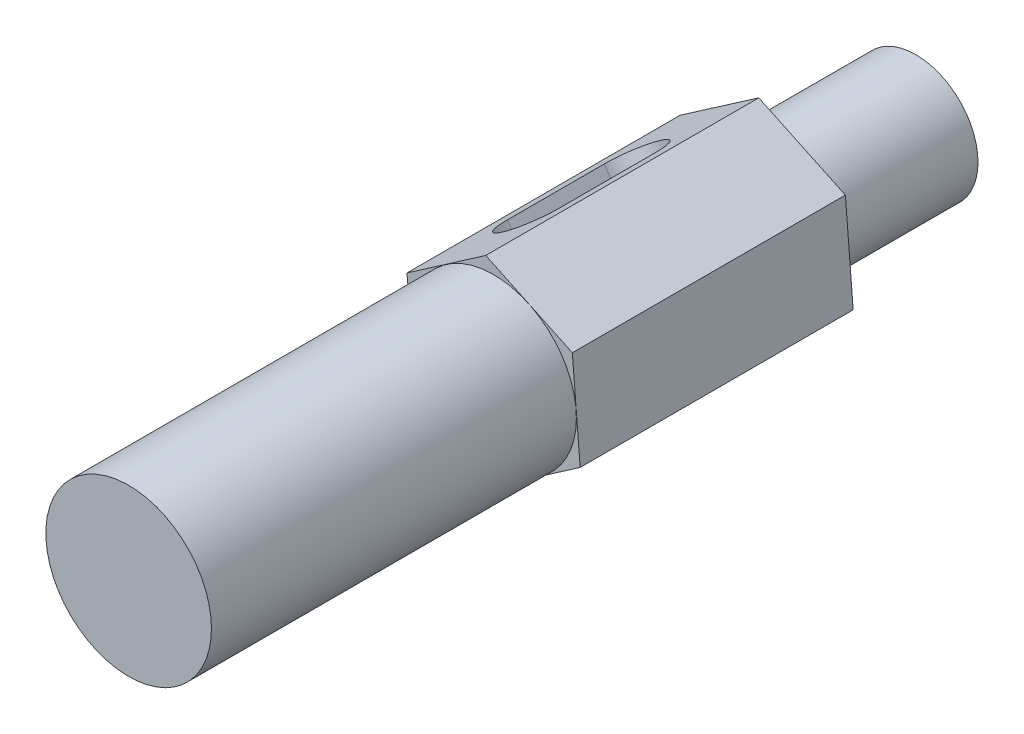
ISO-10303-21;
HEADER;
FILE_DESCRIPTION(('STEP AP214'),'2;1');
FILE_NAME('part.step','',(''),(''),'','','');
FILE_SCHEMA(('AUTOMOTIVE_DESIGN { 1 0 10303 214 1 1 1 1 }'));
ENDSEC;
DATA;
#1=APPLICATION_CONTEXT('core data for automotive mechanical design processes');
#2=APPLICATION_PROTOCOL_DEFINITION('international standard','automotive_design',2000,#1);
#3=PRODUCT_CONTEXT('',#1,'mechanical');
#4=PRODUCT('Part','Part','',(#3));
#5=PRODUCT_RELATED_PRODUCT_CATEGORY('part','',(#4));
#6=PRODUCT_DEFINITION_FORMATION('','',#4);
#7=PRODUCT_DEFINITION_CONTEXT('part definition',#1,'design');
#8=PRODUCT_DEFINITION('design','',#6,#7);
#9=PRODUCT_DEFINITION_SHAPE('','',#8);
#10=(LENGTH_UNIT() NAMED_UNIT(*) SI_UNIT(.MILLI.,.METRE.));
#11=(NAMED_UNIT(*) PLANE_ANGLE_UNIT() SI_UNIT($,.RADIAN.));
#12=(NAMED_UNIT(*) SI_UNIT($,.STERADIAN.) SOLID_ANGLE_UNIT());
#13=UNCERTAINTY_MEASURE_WITH_UNIT(LENGTH_MEASURE(1.E-05),#10,'distance_accuracy_value','');
#14=(GEOMETRIC_REPRESENTATION_CONTEXT(3) GLOBAL_UNCERTAINTY_ASSIGNED_CONTEXT((#13)) GLOBAL_UNIT_ASSIGNED_CONTEXT((#10,
#11,#12)) REPRESENTATION_CONTEXT('',''));
#15=CARTESIAN_POINT('',(0.,0.,0.));
#16=DIRECTION('',(0.,0.,1.));
#17=DIRECTION('',(1.,0.,0.));
#18=AXIS2_PLACEMENT_3D('',#15,#16,#17);
#19=CARTESIAN_POINT('',(0.,0.,0.));
#20=DIRECTION('',(0.,0.,1.));
#21=DIRECTION('',(1.,0.,0.));
#22=AXIS2_PLACEMENT_3D('',#19,#20,#21);
#23=PLANE('',#22);
#24=DIRECTION('',(-0.0816228026846181,0.996663292231588,0.));
#25=VECTOR('',#24,1.);
#26=CARTESIAN_POINT('',(6.62805531976813,-3.13563646034209,0.));
#27=LINE('',#26,#25);
#28=CARTESIAN_POINT('',(6.62805531976813,-3.13563646034209,0.));
#29=VERTEX_POINT('',#28);
#30=CARTESIAN_POINT('',(6.02956849157304,4.17224605443674,0.));
#31=VERTEX_POINT('',#30);
#32=EDGE_CURVE('E195',#29,#31,#27,.T.);
#33=ORIENTED_EDGE('',*,*,#32,.F.);
#34=DIRECTION('',(0.82232432874968,0.569019066768758,0.));
#35=VECTOR('',#34,1.);
#36=CARTESIAN_POINT('',(0.598486828195092,-7.30788251477884,0.));
#37=LINE('',#36,#35);
#38=CARTESIAN_POINT('',(0.598486828195092,-7.30788251477884,0.));
#39=VERTEX_POINT('',#38);
#40=EDGE_CURVE('E200',#39,#29,#37,.T.);
#41=ORIENTED_EDGE('',*,*,#40,.F.);
#42=DIRECTION('',(0.903947131434298,-0.42764422546283,0.));
#43=VECTOR('',#42,1.);
#44=CARTESIAN_POINT('',(-6.02956849157303,-4.17224605443674,0.));
#45=LINE('',#44,#43);
#46=CARTESIAN_POINT('',(-6.02956849157303,-4.17224605443674,0.));
#47=VERTEX_POINT('',#46);
#48=EDGE_CURVE('E219',#47,#39,#45,.T.);
#49=ORIENTED_EDGE('',*,*,#48,.F.);
#50=DIRECTION('',(0.0816228026846182,-0.996663292231588,0.));
#51=VECTOR('',#50,1.);
#52=CARTESIAN_POINT('',(-6.62805531976813,3.13563646034209,0.));
#53=LINE('',#52,#51);
#54=CARTESIAN_POINT('',(-6.62805531976813,3.13563646034209,0.));
#55=VERTEX_POINT('',#54);
#56=EDGE_CURVE('E217',#55,#47,#53,.T.);
#57=ORIENTED_EDGE('',*,*,#56,.F.);
#58=DIRECTION('',(-0.82232432874968,-0.569019066768758,0.));
#59=VECTOR('',#58,1.);
#60=CARTESIAN_POINT('',(-0.598486828195094,7.30788251477884,0.));
#61=LINE('',#60,#59);
#62=CARTESIAN_POINT('',(-0.598486828195094,7.30788251477884,0.));
#63=VERTEX_POINT('',#62);
#64=EDGE_CURVE('E215',#63,#55,#61,.T.);
#65=ORIENTED_EDGE('',*,*,#64,.F.);
#66=DIRECTION('',(-0.903947131434298,0.42764422546283,0.));
#67=VECTOR('',#66,1.);
#68=CARTESIAN_POINT('',(6.02956849157304,4.17224605443674,0.));
#69=LINE('',#68,#67);
#70=EDGE_CURVE('E213',#31,#63,#69,.T.);
#71=ORIENTED_EDGE('',*,*,#70,.F.);
#72=EDGE_LOOP('',(#33,#41,#49,#57,#65,#71));
#73=FACE_BOUND('',#72,.T.);
#74=CARTESIAN_POINT('',(0.,0.,0.));
#75=DIRECTION('',(0.,0.,1.));
#76=DIRECTION('',(1.,0.,0.));
#77=AXIS2_PLACEMENT_3D('',#74,#75,#76);
#78=CIRCLE('',#77,4.75361);
#79=CARTESIAN_POINT('',(4.75361,0.,0.));
#80=VERTEX_POINT('',#79);
#81=EDGE_CURVE('E239',#80,#80,#78,.F.);
#82=ORIENTED_EDGE('',*,*,#81,.F.);
#83=EDGE_LOOP('',(#82));
#84=FACE_BOUND('',#83,.T.);
#85=ADVANCED_FACE('F33',(#73,#84),#23,.F.);
#86=CARTESIAN_POINT('',(0.,0.,20.9042));
#87=DIRECTION('',(0.,0.,1.));
#88=DIRECTION('',(1.,0.,0.));
#89=AXIS2_PLACEMENT_3D('',#86,#87,#88);
#90=PLANE('',#89);
#91=CARTESIAN_POINT('',(0.,0.,20.9042));
#92=DIRECTION('',(0.,0.,1.));
#93=DIRECTION('',(1.,0.,0.));
#94=AXIS2_PLACEMENT_3D('',#91,#92,#93);
#95=CIRCLE('',#94,6.33984);
#96=CARTESIAN_POINT('',(6.33984,0.,20.9042));
#97=VERTEX_POINT('',#96);
#98=EDGE_CURVE('E186',#97,#97,#95,.T.);
#99=ORIENTED_EDGE('',*,*,#98,.F.);
#100=EDGE_LOOP('',(#99));
#101=FACE_BOUND('',#100,.T.);
#102=DIRECTION('',(-0.0816228026846181,0.996663292231588,0.));
#103=VECTOR('',#102,1.);
#104=CARTESIAN_POINT('',(6.62805531976813,-3.13563646034209,20.9042));
#105=LINE('',#104,#103);
#106=CARTESIAN_POINT('',(6.62805531976813,-3.13563646034209,20.9042));
#107=VERTEX_POINT('',#106);
#108=CARTESIAN_POINT('',(6.02956849157304,4.17224605443674,20.9042));
#109=VERTEX_POINT('',#108);
#110=EDGE_CURVE('E196',#107,#109,#105,.T.);
#111=ORIENTED_EDGE('',*,*,#110,.T.);
#112=DIRECTION('',(-0.903947131434298,0.42764422546283,0.));
#113=VECTOR('',#112,1.);
#114=CARTESIAN_POINT('',(6.02956849157304,4.17224605443674,20.9042));
#115=LINE('',#114,#113);
#116=CARTESIAN_POINT('',(-0.598486828195094,7.30788251477884,20.9042));
#117=VERTEX_POINT('',#116);
#118=EDGE_CURVE('E199',#109,#117,#115,.T.);
#119=ORIENTED_EDGE('',*,*,#118,.T.);
#120=DIRECTION('',(-0.82232432874968,-0.569019066768758,0.));
#121=VECTOR('',#120,1.);
#122=CARTESIAN_POINT('',(-0.598486828195094,7.30788251477884,20.9042));
#123=LINE('',#122,#121);
#124=CARTESIAN_POINT('',(-6.62805531976813,3.13563646034209,20.9042));
#125=VERTEX_POINT('',#124);
#126=EDGE_CURVE('E202',#117,#125,#123,.T.);
#127=ORIENTED_EDGE('',*,*,#126,.T.);
#128=DIRECTION('',(0.0816228026846182,-0.996663292231588,0.));
#129=VECTOR('',#128,1.);
#130=CARTESIAN_POINT('',(-6.62805531976813,3.13563646034209,20.9042));
#131=LINE('',#130,#129);
#132=CARTESIAN_POINT('',(-6.02956849157303,-4.17224605443674,20.9042));
#133=VERTEX_POINT('',#132);
#134=EDGE_CURVE('E204',#125,#133,#131,.T.);
#135=ORIENTED_EDGE('',*,*,#134,.T.);
#136=DIRECTION('',(0.903947131434298,-0.42764422546283,0.));
#137=VECTOR('',#136,1.);
#138=CARTESIAN_POINT('',(-6.02956849157303,-4.17224605443674,20.9042));
#139=LINE('',#138,#137);
#140=CARTESIAN_POINT('',(0.598486828195092,-7.30788251477884,20.9042));
#141=VERTEX_POINT('',#140);
#142=EDGE_CURVE('E206',#133,#141,#139,.T.);
#143=ORIENTED_EDGE('',*,*,#142,.T.);
#144=DIRECTION('',(0.82232432874968,0.569019066768758,0.));
#145=VECTOR('',#144,1.);
#146=CARTESIAN_POINT('',(0.598486828195092,-7.30788251477884,20.9042));
#147=LINE('',#146,#145);
#148=EDGE_CURVE('E208',#141,#107,#147,.T.);
#149=ORIENTED_EDGE('',*,*,#148,.T.);
#150=EDGE_LOOP('',(#111,#119,#127,#135,#143,#149));
#151=FACE_BOUND('',#150,.T.);
#152=ADVANCED_FACE('F324',(#101,#151),#90,.T.);
#153=CARTESIAN_POINT('',(6.62805531976813,-3.13563646034209,20.9042));
#154=DIRECTION('',(-0.996663292231588,-0.0816228026846181,0.));
#155=DIRECTION('',(0.0816228026846181,-0.996663292231588,0.));
#156=AXIS2_PLACEMENT_3D('',#153,#154,#155);
#157=PLANE('',#156);
#158=ORIENTED_EDGE('',*,*,#32,.T.);
#159=DIRECTION('',(0.,0.,-1.));
#160=VECTOR('',#159,1.);
#161=CARTESIAN_POINT('',(6.02956849157304,4.17224605443674,20.9042));
#162=LINE('',#161,#160);
#163=EDGE_CURVE('E236',#109,#31,#162,.T.);
#164=ORIENTED_EDGE('',*,*,#163,.F.);
#165=ORIENTED_EDGE('',*,*,#110,.F.);
#166=DIRECTION('',(0.,0.,-1.));
#167=VECTOR('',#166,1.);
#168=CARTESIAN_POINT('',(6.62805531976813,-3.13563646034209,20.9042));
#169=LINE('',#168,#167);
#170=EDGE_CURVE('E210',#107,#29,#169,.T.);
#171=ORIENTED_EDGE('',*,*,#170,.T.);
#172=EDGE_LOOP('',(#158,#164,#165,#171));
#173=FACE_BOUND('',#172,.T.);
#174=ADVANCED_FACE('F35',(#173),#157,.F.);
#175=CARTESIAN_POINT('',(6.02956849157304,4.17224605443674,20.9042));
#176=DIRECTION('',(-0.42764422546283,-0.903947131434298,0.));
#177=DIRECTION('',(0.903947131434298,-0.42764422546283,0.));
#178=AXIS2_PLACEMENT_3D('',#175,#176,#177);
#179=PLANE('',#178);
#180=ORIENTED_EDGE('',*,*,#70,.T.);
#181=DIRECTION('',(0.,0.,-1.));
#182=VECTOR('',#181,1.);
#183=CARTESIAN_POINT('',(-0.598486828195094,7.30788251477884,20.9042));
#184=LINE('',#183,#182);
#185=EDGE_CURVE('E233',#117,#63,#184,.T.);
#186=ORIENTED_EDGE('',*,*,#185,.F.);
#187=ORIENTED_EDGE('',*,*,#118,.F.);
#188=ORIENTED_EDGE('',*,*,#163,.T.);
#189=EDGE_LOOP('',(#180,#186,#187,#188));
#190=FACE_BOUND('',#189,.T.);
#191=ADVANCED_FACE('F342',(#190),#179,.F.);
#192=CARTESIAN_POINT('',(-0.598486828195094,7.30788251477884,20.9042));
#193=DIRECTION('',(0.569019066768758,-0.82232432874968,0.));
#194=DIRECTION('',(0.82232432874968,0.569019066768758,0.));
#195=AXIS2_PLACEMENT_3D('',#192,#193,#194);
#196=PLANE('',#195);
#197=DIRECTION('',(0.,0.,-1.));
#198=VECTOR('',#197,1.);
#199=CARTESIAN_POINT('',(-1.64988950665888,6.58034941137755,14.2748));
#200=LINE('',#199,#198);
#201=CARTESIAN_POINT('',(-1.64988950665888,6.58034941137755,14.2748));
#202=VERTEX_POINT('',#201);
#203=CARTESIAN_POINT('',(-1.64988950665888,6.58034941137755,6.858));
#204=VERTEX_POINT('',#203);
#205=EDGE_CURVE('E154',#202,#204,#200,.T.);
#206=ORIENTED_EDGE('',*,*,#205,.F.);
#207=CARTESIAN_POINT('',(-3.61327107398161,5.22175948756047,14.2748));
#208=DIRECTION('',(-0.569019066768758,0.82232432874968,0.));
#209=DIRECTION('',(-0.82232432874968,-0.569019066768758,0.));
#210=AXIS2_PLACEMENT_3D('',#207,#208,#209);
#211=CIRCLE('',#210,2.3876);
#212=CARTESIAN_POINT('',(-5.57665264130435,3.86316956374338,14.2748));
#213=VERTEX_POINT('',#212);
#214=EDGE_CURVE('E53',#213,#202,#211,.T.);
#215=ORIENTED_EDGE('',*,*,#214,.F.);
#216=DIRECTION('',(0.,0.,1.));
#217=VECTOR('',#216,1.);
#218=CARTESIAN_POINT('',(-5.57665264130435,3.86316956374338,14.2748));
#219=LINE('',#218,#217);
#220=CARTESIAN_POINT('',(-5.57665264130435,3.86316956374338,6.858));
#221=VERTEX_POINT('',#220);
#222=EDGE_CURVE('E162',#221,#213,#219,.T.);
#223=ORIENTED_EDGE('',*,*,#222,.F.);
#224=CARTESIAN_POINT('',(-3.61327107398161,5.22175948756047,6.858));
#225=DIRECTION('',(-0.569019066768758,0.82232432874968,0.));
#226=DIRECTION('',(-0.82232432874968,-0.569019066768758,0.));
#227=AXIS2_PLACEMENT_3D('',#224,#225,#226);
#228=CIRCLE('',#227,2.3876);
#229=EDGE_CURVE('E145',#204,#221,#228,.T.);
#230=ORIENTED_EDGE('',*,*,#229,.F.);
#231=EDGE_LOOP('',(#206,#215,#223,#230));
#232=FACE_BOUND('',#231,.T.);
#233=ORIENTED_EDGE('',*,*,#64,.T.);
#234=DIRECTION('',(0.,0.,-1.));
#235=VECTOR('',#234,1.);
#236=CARTESIAN_POINT('',(-6.62805531976813,3.13563646034209,20.9042));
#237=LINE('',#236,#235);
#238=EDGE_CURVE('E230',#125,#55,#237,.T.);
#239=ORIENTED_EDGE('',*,*,#238,.F.);
#240=ORIENTED_EDGE('',*,*,#126,.F.);
#241=ORIENTED_EDGE('',*,*,#185,.T.);
#242=EDGE_LOOP('',(#233,#239,#240,#241));
#243=FACE_BOUND('',#242,.T.);
#244=ADVANCED_FACE('F159',(#232,#243),#196,.F.);
#245=CARTESIAN_POINT('',(-6.62805531976813,3.13563646034209,20.9042));
#246=DIRECTION('',(0.996663292231588,0.0816228026846182,0.));
#247=DIRECTION('',(-0.0816228026846182,0.996663292231588,0.));
#248=AXIS2_PLACEMENT_3D('',#245,#246,#247);
#249=PLANE('',#248);
#250=ORIENTED_EDGE('',*,*,#56,.T.);
#251=DIRECTION('',(0.,0.,-1.));
#252=VECTOR('',#251,1.);
#253=CARTESIAN_POINT('',(-6.02956849157303,-4.17224605443674,20.9042));
#254=LINE('',#253,#252);
#255=EDGE_CURVE('E227',#133,#47,#254,.T.);
#256=ORIENTED_EDGE('',*,*,#255,.F.);
#257=ORIENTED_EDGE('',*,*,#134,.F.);
#258=ORIENTED_EDGE('',*,*,#238,.T.);
#259=EDGE_LOOP('',(#250,#256,#257,#258));
#260=FACE_BOUND('',#259,.T.);
#261=ADVANCED_FACE('F336',(#260),#249,.F.);
#262=CARTESIAN_POINT('',(-6.02956849157303,-4.17224605443674,20.9042));
#263=DIRECTION('',(0.42764422546283,0.903947131434298,0.));
#264=DIRECTION('',(-0.903947131434298,0.42764422546283,0.));
#265=AXIS2_PLACEMENT_3D('',#262,#263,#264);
#266=PLANE('',#265);
#267=ORIENTED_EDGE('',*,*,#48,.T.);
#268=DIRECTION('',(0.,0.,-1.));
#269=VECTOR('',#268,1.);
#270=CARTESIAN_POINT('',(0.598486828195092,-7.30788251477884,20.9042));
#271=LINE('',#270,#269);
#272=EDGE_CURVE('E224',#141,#39,#271,.T.);
#273=ORIENTED_EDGE('',*,*,#272,.F.);
#274=ORIENTED_EDGE('',*,*,#142,.F.);
#275=ORIENTED_EDGE('',*,*,#255,.T.);
#276=EDGE_LOOP('',(#267,#273,#274,#275));
#277=FACE_BOUND('',#276,.T.);
#278=ADVANCED_FACE('F318',(#277),#266,.F.);
#279=CARTESIAN_POINT('',(0.598486828195092,-7.30788251477884,20.9042));
#280=DIRECTION('',(-0.569019066768758,0.82232432874968,0.));
#281=DIRECTION('',(-0.82232432874968,-0.569019066768758,0.));
#282=AXIS2_PLACEMENT_3D('',#279,#280,#281);
#283=PLANE('',#282);
#284=DIRECTION('',(0.,0.,-1.));
#285=VECTOR('',#284,1.);
#286=CARTESIAN_POINT('',(1.64988950665888,-6.58034941137755,14.2748));
#287=LINE('',#286,#285);
#288=CARTESIAN_POINT('',(1.64988950665888,-6.58034941137755,14.2748));
#289=VERTEX_POINT('',#288);
#290=CARTESIAN_POINT('',(1.64988950665888,-6.58034941137755,6.858));
#291=VERTEX_POINT('',#290);
#292=EDGE_CURVE('E498',#289,#291,#287,.T.);
#293=ORIENTED_EDGE('',*,*,#292,.F.);
#294=CARTESIAN_POINT('',(3.61327107398161,-5.22175948756047,14.2748));
#295=DIRECTION('',(-0.569019066768758,0.82232432874968,0.));
#296=DIRECTION('',(-0.82232432874968,-0.569019066768758,0.));
#297=AXIS2_PLACEMENT_3D('',#294,#295,#296);
#298=CIRCLE('',#297,2.3876);
#299=CARTESIAN_POINT('',(5.57665264130435,-3.86316956374338,14.2748));
#300=VERTEX_POINT('',#299);
#301=EDGE_CURVE('E180',#300,#289,#298,.F.);
#302=ORIENTED_EDGE('',*,*,#301,.F.);
#303=DIRECTION('',(0.,0.,1.));
#304=VECTOR('',#303,1.);
#305=CARTESIAN_POINT('',(5.57665264130435,-3.86316956374338,14.2748));
#306=LINE('',#305,#304);
#307=CARTESIAN_POINT('',(5.57665264130435,-3.86316956374338,6.858));
#308=VERTEX_POINT('',#307);
#309=EDGE_CURVE('E177',#308,#300,#306,.T.);
#310=ORIENTED_EDGE('',*,*,#309,.F.);
#311=CARTESIAN_POINT('',(3.61327107398161,-5.22175948756047,6.858));
#312=DIRECTION('',(-0.569019066768758,0.82232432874968,0.));
#313=DIRECTION('',(-0.82232432874968,-0.569019066768758,0.));
#314=AXIS2_PLACEMENT_3D('',#311,#312,#313);
#315=CIRCLE('',#314,2.3876);
#316=EDGE_CURVE('E170',#291,#308,#315,.F.);
#317=ORIENTED_EDGE('',*,*,#316,.F.);
#318=EDGE_LOOP('',(#293,#302,#310,#317));
#319=FACE_BOUND('',#318,.T.);
#320=ORIENTED_EDGE('',*,*,#40,.T.);
#321=ORIENTED_EDGE('',*,*,#170,.F.);
#322=ORIENTED_EDGE('',*,*,#148,.F.);
#323=ORIENTED_EDGE('',*,*,#272,.T.);
#324=EDGE_LOOP('',(#320,#321,#322,#323));
#325=FACE_BOUND('',#324,.T.);
#326=ADVANCED_FACE('F313',(#319,#325),#283,.F.);
#327=CARTESIAN_POINT('',(0.,0.,48.8442));
#328=DIRECTION('',(0.,0.,-1.));
#329=DIRECTION('',(-1.,0.,0.));
#330=AXIS2_PLACEMENT_3D('',#327,#328,#329);
#331=CYLINDRICAL_SURFACE('',#330,6.33984);
#332=CARTESIAN_POINT('',(0.,0.,48.8442));
#333=DIRECTION('',(0.,0.,1.));
#334=DIRECTION('',(1.,0.,0.));
#335=AXIS2_PLACEMENT_3D('',#332,#333,#334);
#336=CIRCLE('',#335,6.33984);
#337=CARTESIAN_POINT('',(6.33984,0.,48.8442));
#338=VERTEX_POINT('',#337);
#339=EDGE_CURVE('E187',#338,#338,#336,.T.);
#340=ORIENTED_EDGE('',*,*,#339,.F.);
#341=EDGE_LOOP('',(#340));
#342=FACE_BOUND('',#341,.T.);
#343=ORIENTED_EDGE('',*,*,#98,.T.);
#344=EDGE_LOOP('',(#343));
#345=FACE_BOUND('',#344,.T.);
#346=ADVANCED_FACE('F308',(#342,#345),#331,.T.);
#347=CARTESIAN_POINT('',(0.,0.,48.8442));
#348=DIRECTION('',(0.,0.,1.));
#349=DIRECTION('',(1.,0.,0.));
#350=AXIS2_PLACEMENT_3D('',#347,#348,#349);
#351=PLANE('',#350);
#352=ORIENTED_EDGE('',*,*,#339,.T.);
#353=EDGE_LOOP('',(#352));
#354=FACE_BOUND('',#353,.T.);
#355=ADVANCED_FACE('F300',(#354),#351,.T.);
#356=CARTESIAN_POINT('',(0.,0.,-11.43));
#357=DIRECTION('',(0.,0.,-1.));
#358=DIRECTION('',(-1.,0.,0.));
#359=AXIS2_PLACEMENT_3D('',#356,#357,#358);
#360=PLANE('',#359);
#361=CARTESIAN_POINT('',(0.,0.,-11.43));
#362=DIRECTION('',(0.,0.,-1.));
#363=DIRECTION('',(-1.,0.,0.));
#364=AXIS2_PLACEMENT_3D('',#361,#362,#363);
#365=CIRCLE('',#364,4.75361);
#366=CARTESIAN_POINT('',(-4.75361,0.,-11.43));
#367=VERTEX_POINT('',#366);
#368=EDGE_CURVE('E183',#367,#367,#365,.T.);
#369=ORIENTED_EDGE('',*,*,#368,.T.);
#370=EDGE_LOOP('',(#369));
#371=FACE_BOUND('',#370,.T.);
#372=CARTESIAN_POINT('',(0.,0.,-11.43));
#373=DIRECTION('',(0.,0.,-1.));
#374=DIRECTION('',(-1.,0.,0.));
#375=AXIS2_PLACEMENT_3D('',#372,#373,#374);
#376=CIRCLE('',#375,2.7305);
#377=CARTESIAN_POINT('',(-2.7305,0.,-11.43));
#378=VERTEX_POINT('',#377);
#379=EDGE_CURVE('E179',#378,#378,#376,.T.);
#380=ORIENTED_EDGE('',*,*,#379,.F.);
#381=EDGE_LOOP('',(#380));
#382=FACE_BOUND('',#381,.T.);
#383=ADVANCED_FACE('F295',(#371,#382),#360,.T.);
#384=CARTESIAN_POINT('',(0.,0.,-11.43));
#385=DIRECTION('',(0.,0.,1.));
#386=DIRECTION('',(1.,0.,0.));
#387=AXIS2_PLACEMENT_3D('',#384,#385,#386);
#388=CYLINDRICAL_SURFACE('',#387,4.75361);
#389=ORIENTED_EDGE('',*,*,#368,.F.);
#390=EDGE_LOOP('',(#389));
#391=FACE_BOUND('',#390,.T.);
#392=ORIENTED_EDGE('',*,*,#81,.T.);
#393=EDGE_LOOP('',(#392));
#394=FACE_BOUND('',#393,.T.);
#395=ADVANCED_FACE('F299',(#391,#394),#388,.T.);
#396=CARTESIAN_POINT('',(0.,0.,20.9042));
#397=DIRECTION('',(0.,0.,1.));
#398=DIRECTION('',(1.,0.,0.));
#399=AXIS2_PLACEMENT_3D('',#396,#397,#398);
#400=PLANE('',#399);
#401=CARTESIAN_POINT('',(0.,0.,20.9042));
#402=DIRECTION('',(0.,0.,1.));
#403=DIRECTION('',(1.,0.,0.));
#404=AXIS2_PLACEMENT_3D('',#401,#402,#403);
#405=CIRCLE('',#404,2.7305);
#406=CARTESIAN_POINT('',(2.7305,0.,20.9042));
#407=VERTEX_POINT('',#406);
#408=EDGE_CURVE('E190',#407,#407,#405,.T.);
#409=ORIENTED_EDGE('',*,*,#408,.F.);
#410=EDGE_LOOP('',(#409));
#411=FACE_BOUND('',#410,.T.);
#412=ADVANCED_FACE('F304',(#411),#400,.F.);
#413=CARTESIAN_POINT('',(0.,0.,20.9042));
#414=DIRECTION('',(0.,0.,-1.));
#415=DIRECTION('',(-1.,0.,0.));
#416=AXIS2_PLACEMENT_3D('',#413,#414,#415);
#417=CYLINDRICAL_SURFACE('',#416,2.7305);
#418=CARTESIAN_POINT('',(-1.20956627222676,-2.44797460834288,14.2748));
#419=CARTESIAN_POINT('',(-1.20958804728556,-2.44795600574634,14.3137370238867));
#420=CARTESIAN_POINT('',(-1.20780500639254,-2.4488453625985,14.3526434063581));
#421=CARTESIAN_POINT('',(-1.20082907939943,-2.45227724346911,14.4299877879825));
#422=CARTESIAN_POINT('',(-1.19564412570554,-2.45481592154996,14.4684266653826));
#423=CARTESIAN_POINT('',(-1.17550456149749,-2.46455700969224,14.5813992865273));
#424=CARTESIAN_POINT('',(-1.15595075921854,-2.47389567432168,14.6549426633927));
#425=CARTESIAN_POINT('',(-1.0959945944534,-2.50118054513015,14.830381491283));
#426=CARTESIAN_POINT('',(-1.05015994536887,-2.521109613033,14.9300224901687));
#427=CARTESIAN_POINT('',(-0.944097354123204,-2.56273336483108,15.1218744964873));
#428=CARTESIAN_POINT('',(-0.883729638318483,-2.58444375499189,15.2140009431911));
#429=CARTESIAN_POINT('',(-0.766202411779167,-2.62136433599547,15.3725927853069));
#430=CARTESIAN_POINT('',(-0.710975907218241,-2.63698860750061,15.4404165165341));
#431=CARTESIAN_POINT('',(-0.595010324896942,-2.66555049927489,15.5718443555924));
#432=CARTESIAN_POINT('',(-0.534268318041817,-2.67848667985734,15.6354461899156));
#433=CARTESIAN_POINT('',(-0.408219379066574,-2.700568809728,15.7582798703896));
#434=CARTESIAN_POINT('',(-0.342926351007126,-2.70972575889771,15.8175239805732));
#435=CARTESIAN_POINT('',(-0.208183404593132,-2.72339480295892,15.9316622893514));
#436=CARTESIAN_POINT('',(-0.138733147709464,-2.72790651903646,15.9865561328493));
#437=CARTESIAN_POINT('',(0.0422689357816321,-2.73237618038784,16.1199533663154));
#438=CARTESIAN_POINT('',(0.156352189690837,-2.72857333586334,16.1952512508472));
#439=CARTESIAN_POINT('',(0.390846258105553,-2.70494255615682,16.3322163094893));
#440=CARTESIAN_POINT('',(0.511247918203365,-2.68513723775181,16.3939025647814));
#441=CARTESIAN_POINT('',(0.732262561931,-2.63245170536222,16.4904569928151));
#442=CARTESIAN_POINT('',(0.832363270033199,-2.60271104204245,16.5281834007108));
#443=CARTESIAN_POINT('',(1.03196256092881,-2.53020335705912,16.5905494006242));
#444=CARTESIAN_POINT('',(1.13146148948677,-2.48744472321266,16.61519739144));
#445=CARTESIAN_POINT('',(1.32715890684583,-2.38879429421875,16.6498763383856));
#446=CARTESIAN_POINT('',(1.42333740447988,-2.33283495800721,16.6598301448504));
#447=CARTESIAN_POINT('',(1.60833539080505,-2.20935405894872,16.6640917202423));
#448=CARTESIAN_POINT('',(1.69715623227065,-2.14183462856658,16.6584023719176));
#449=CARTESIAN_POINT('',(1.85745164654654,-2.0039303436805,16.6329799056286));
#450=CARTESIAN_POINT('',(1.92975849987152,-1.93427420763016,16.6144788166646));
#451=CARTESIAN_POINT('',(2.06452403769368,-1.78973277590448,16.5658872006935));
#452=CARTESIAN_POINT('',(2.1269808919004,-1.71484651210736,16.5357945233482));
#453=CARTESIAN_POINT('',(2.24550632836589,-1.55683801181048,16.4630741143019));
#454=CARTESIAN_POINT('',(2.30084527588764,-1.47350285777679,16.4197295110521));
#455=CARTESIAN_POINT('',(2.40005108995942,-1.30572264364609,16.32329775837));
#456=CARTESIAN_POINT('',(2.44391126700306,-1.22127696633725,16.2702049584896));
#457=CARTESIAN_POINT('',(2.54085450459287,-1.00961574642037,16.1262181412084));
#458=CARTESIAN_POINT('',(2.58701315175088,-0.882821754159293,16.0299575119011));
#459=CARTESIAN_POINT('',(2.64058232284328,-0.697936649433188,15.8741066695275));
#460=CARTESIAN_POINT('',(2.65584108672536,-0.637083262872441,15.8201341312328));
#461=CARTESIAN_POINT('',(2.68164866417678,-0.517786498965325,15.7085052265537));
#462=CARTESIAN_POINT('',(2.69219873031374,-0.459342484457465,15.6508498445183));
#463=CARTESIAN_POINT('',(2.70793232523005,-0.353782377323793,15.5404065546315));
#464=CARTESIAN_POINT('',(2.71366725558983,-0.306240884134682,15.4881002341141));
#465=CARTESIAN_POINT('',(2.72248322429048,-0.214132986918551,15.3807213153246));
#466=CARTESIAN_POINT('',(2.72556475522915,-0.169566032092793,15.3256492325202));
#467=CARTESIAN_POINT('',(2.72952957875357,-0.0843371453574596,15.2126553055604));
#468=CARTESIAN_POINT('',(2.7304176244207,-0.0436669538012805,15.1547399010614));
#469=CARTESIAN_POINT('',(2.73057124817036,0.0326420267651488,15.0357187484235));
#470=CARTESIAN_POINT('',(2.72983824041979,0.0682851723877777,14.9746158264045));
#471=CARTESIAN_POINT('',(2.72731640115077,0.136647231876165,14.8415903162704));
#472=CARTESIAN_POINT('',(2.72541457538757,0.168542484484725,14.7692363072673));
#473=CARTESIAN_POINT('',(2.72170654881676,0.220549096429303,14.6205708276218));
#474=CARTESIAN_POINT('',(2.7198999243009,0.240717551580314,14.5442805348074));
#475=CARTESIAN_POINT('',(2.71822960453197,0.258615972714549,14.4351360734195));
#476=CARTESIAN_POINT('',(2.71784868300098,0.262562443418339,14.4032640414765));
#477=CARTESIAN_POINT('',(2.71732992089061,0.267866178984291,14.3392013110597));
#478=CARTESIAN_POINT('',(2.71719286586135,0.269215077612701,14.3070099174597));
#479=CARTESIAN_POINT('',(2.71719686241872,0.269205239291295,14.2748));
#480=B_SPLINE_CURVE_WITH_KNOTS('',3,(#418,#419,#420,#421,#422,#423,#424,#425,#426,#427,#428,
#429,#430,#431,#432,#433,#434,#435,#436,#437,#438,#439,#440,#441,#442,#443,#444,#445,#446,#447,
#448,#449,#450,#451,#452,#453,#454,#455,#456,#457,#458,#459,#460,#461,#462,#463,#464,#465,#466,
#467,#468,#469,#470,#471,#472,#473,#474,#475,#476,#477,#478,#479),.UNSPECIFIED.,.F.,.F.,(4,2,2,
2,2,2,2,2,2,2,2,2,2,2,2,2,2,2,2,2,2,2,2,2,2,2,2,2,2,2,4),(0.,0.116707610783209,
0.233144051267017,0.462023119418259,0.794621339882964,1.13055601224514,1.39679191043091,
1.66317003369426,1.92876727034762,2.19438616446617,2.60304835721201,3.01113398359477,
3.34286829115614,3.67438930441454,4.0076448050768,4.34083889694397,4.64577357875149,
4.95076485580357,5.27662711003191,5.60267884691499,6.09702199667343,6.3451278198805,
6.59316760469942,6.80576671633365,7.01832635089181,7.2304249825527,7.44233865760833,
7.67892575215785,7.91435108376588,8.01060914238142,8.10717671282293),.UNSPECIFIED.);
#481=CARTESIAN_POINT('',(-1.20956627222676,-2.44797460834287,14.2748));
#482=VERTEX_POINT('',#481);
#483=CARTESIAN_POINT('',(2.71719686241872,0.269205239291296,14.2748));
#484=VERTEX_POINT('',#483);
#485=EDGE_CURVE('E11',#482,#484,#480,.T.);
#486=ORIENTED_EDGE('',*,*,#485,.F.);
#487=DIRECTION('',(0.,0.,-1.));
#488=VECTOR('',#487,1.);
#489=CARTESIAN_POINT('',(-1.20956627222676,-2.44797460834288,20.9042));
#490=LINE('',#489,#488);
#491=CARTESIAN_POINT('',(-1.20956627222676,-2.44797460834288,6.858));
#492=VERTEX_POINT('',#491);
#493=EDGE_CURVE('E46',#492,#482,#490,.F.);
#494=ORIENTED_EDGE('',*,*,#493,.F.);
#495=CARTESIAN_POINT('',(2.71719686241872,0.26920523929129,6.858));
#496=CARTESIAN_POINT('',(2.71718712771513,0.269232173383624,6.81906297611325));
#497=CARTESIAN_POINT('',(2.71739101495952,0.267250098604957,6.78015659364186));
#498=CARTESIAN_POINT('',(2.71814413608805,0.259512258319121,6.70281221201746));
#499=CARTESIAN_POINT('',(2.71869256645807,0.253765271688265,6.66437333461742));
#500=CARTESIAN_POINT('',(2.72071075242585,0.231484836995802,6.55140071347273));
#501=CARTESIAN_POINT('',(2.7225587785774,0.209894407635361,6.47785733660725));
#502=CARTESIAN_POINT('',(2.72696232791187,0.144169110970843,6.30241850871697));
#503=CARTESIAN_POINT('',(2.72945895958751,0.0942516828073726,6.20277750983126));
#504=CARTESIAN_POINT('',(2.73103185619528,-0.0196752059053242,6.01092550351267));
#505=CARTESIAN_POINT('',(2.73007355855452,-0.0838210071556452,5.9187990568089));
#506=CARTESIAN_POINT('',(2.72320452233747,-0.20681935926296,5.76020721469313));
#507=CARTESIAN_POINT('',(2.71836255379991,-0.264008868849646,5.69238348346585));
#508=CARTESIAN_POINT('',(2.70422152903638,-0.382599886062083,5.56095564440764));
#509=CARTESIAN_POINT('',(2.6949200931848,-0.444003627446047,5.49735381008438));
#510=CARTESIAN_POINT('',(2.67116134727945,-0.569747324979616,5.37452012961038));
#511=CARTESIAN_POINT('',(2.65671923158778,-0.634078145941399,5.31527601942678));
#512=CARTESIAN_POINT('',(2.62202314431049,-0.764992949922917,5.20113771064862));
#513=CARTESIAN_POINT('',(2.60176869890759,-0.831577116243392,5.14624386715069));
#514=CARTESIAN_POINT('',(2.54216017340072,-1.00254072578534,5.01284663368454));
#515=CARTESIAN_POINT('',(2.49839444656737,-1.10796373847108,4.93754874915277));
#516=CARTESIAN_POINT('',(2.39363607773226,-1.31908352918297,4.80058369051073));
#517=CARTESIAN_POINT('',(2.33266782766472,-1.42477971111559,4.73889743521861));
#518=CARTESIAN_POINT('',(2.20546957808245,-1.6130450647217,4.64234300718488));
#519=CARTESIAN_POINT('',(2.14235822812078,-1.69624131658005,4.60461659928923));
#520=CARTESIAN_POINT('',(2.00415719711779,-1.85747939005335,4.54225059937576));
#521=CARTESIAN_POINT('',(1.92907524384199,-1.93552449140435,4.51760260855998));
#522=CARTESIAN_POINT('',(1.76778403549313,-2.08389744180655,4.48292366161437));
#523=CARTESIAN_POINT('',(1.68151861860984,-2.15418277858693,4.47296985514958));
#524=CARTESIAN_POINT('',(1.50076100117866,-2.2837916946277,4.46870827975765));
#525=CARTESIAN_POINT('',(1.40627031950452,-2.34311729141815,4.47439762808237));
#526=CARTESIAN_POINT('',(1.22072081314722,-2.44452534000592,4.49982009437135));
#527=CARTESIAN_POINT('',(1.1300506252975,-2.48764349583987,4.51832118333545));
#528=CARTESIAN_POINT('',(0.947287446922299,-2.56282059541147,4.56691279930647));
#529=CARTESIAN_POINT('',(0.855194195450864,-2.59487748509701,4.59700547665176));
#530=CARTESIAN_POINT('',(0.66555161718878,-2.65011024499108,4.66972588569812));
#531=CARTESIAN_POINT('',(0.568060182939368,-2.67252825691511,4.7130704889479));
#532=CARTESIAN_POINT('',(0.376081782203165,-2.70623711999529,4.80950224162996));
#533=CARTESIAN_POINT('',(0.281596595720588,-2.71752149334076,4.86259504151042));
#534=CARTESIAN_POINT('',(0.0493501608040831,-2.73364777002423,5.00658185879162));
#535=CARTESIAN_POINT('',(-0.0855761825664652,-2.73215812388783,5.10284248809889));
#536=CARTESIAN_POINT('',(-0.277478031132094,-2.71713019794295,5.25869333047253));
#537=CARTESIAN_POINT('',(-0.33980456442758,-2.70996306612561,5.31266586876716));
#538=CARTESIAN_POINT('',(-0.460542307094693,-2.69207042997909,5.42429477344633));
#539=CARTESIAN_POINT('',(-0.518954554193431,-2.68134587329057,5.48195015548166));
#540=CARTESIAN_POINT('',(-0.623286612791275,-2.65886691032964,5.59239344536846));
#541=CARTESIAN_POINT('',(-0.669798862638184,-2.64747859987284,5.64469976588588));
#542=CARTESIAN_POINT('',(-0.759103842088306,-2.62326689445746,5.75207868467542));
#543=CARTESIAN_POINT('',(-0.801897260757566,-2.61044376636934,5.8071507674798));
#544=CARTESIAN_POINT('',(-0.883054900073596,-2.58411658383164,5.92014469443957));
#545=CARTESIAN_POINT('',(-0.921428525549025,-2.57061406650357,5.9780600989386));
#546=CARTESIAN_POINT('',(-0.992895392912136,-2.54386390791249,6.09708125157654));
#547=CARTESIAN_POINT('',(-1.02599321027781,-2.53061605465746,6.15818417359546));
#548=CARTESIAN_POINT('',(-1.08908013352884,-2.5041628702459,6.29120968372961));
#549=CARTESIAN_POINT('',(-1.11825860411017,-2.4911420816856,6.3635636927327));
#550=CARTESIAN_POINT('',(-1.16562145003647,-2.46934304563435,6.51222917237824));
#551=CARTESIAN_POINT('',(-1.18385910839649,-2.46054427908085,6.5885194651926));
#552=CARTESIAN_POINT('',(-1.20002042470333,-2.45267311001526,6.69766392658045));
#553=CARTESIAN_POINT('',(-1.20357942588546,-2.45092575692721,6.72953595852349));
#554=CARTESIAN_POINT('',(-1.20836002520018,-2.4485710604982,6.79359868894031));
#555=CARTESIAN_POINT('',(-1.20957407076137,-2.44796740085394,6.82579008254032));
#556=CARTESIAN_POINT('',(-1.20956627222675,-2.44797460834288,6.858));
#557=B_SPLINE_CURVE_WITH_KNOTS('',3,(#495,#496,#497,#498,#499,#500,#501,#502,#503,#504,#505,
#506,#507,#508,#509,#510,#511,#512,#513,#514,#515,#516,#517,#518,#519,#520,#521,#522,#523,#524,
#525,#526,#527,#528,#529,#530,#531,#532,#533,#534,#535,#536,#537,#538,#539,#540,#541,#542,#543,
#544,#545,#546,#547,#548,#549,#550,#551,#552,#553,#554,#555,#556),.UNSPECIFIED.,.F.,.F.,(4,2,2,
2,2,2,2,2,2,2,2,2,2,2,2,2,2,2,2,2,2,2,2,2,2,2,2,2,2,2,4),(0.,0.116707610783209,
0.233144051267017,0.462023119418259,0.79462133988297,1.13055601224515,1.39679191043092,
1.66317003369427,1.92876727034763,2.19438616446618,2.60304835721202,3.01113398359478,
3.34286829115614,3.67438930441454,4.0076448050768,4.34083889694397,4.64577357875149,
4.95076485580357,5.27662711003192,5.602678846915,6.09702199667343,6.34512781988051,
6.59316760469942,6.80576671633366,7.01832635089182,7.2304249825527,7.44233865760833,
7.67892575215786,7.91435108376588,8.01060914238142,8.10717671282293),.UNSPECIFIED.);
#558=CARTESIAN_POINT('',(2.71719686241871,0.269205239291295,6.858));
#559=VERTEX_POINT('',#558);
#560=EDGE_CURVE('E264',#559,#492,#557,.T.);
#561=ORIENTED_EDGE('',*,*,#560,.F.);
#562=DIRECTION('',(0.,0.,-1.));
#563=VECTOR('',#562,1.);
#564=CARTESIAN_POINT('',(2.71719686241872,0.269205239291296,20.9042));
#565=LINE('',#564,#563);
#566=EDGE_CURVE('E269',#484,#559,#565,.T.);
#567=ORIENTED_EDGE('',*,*,#566,.F.);
#568=EDGE_LOOP('',(#486,#494,#561,#567));
#569=FACE_BOUND('',#568,.T.);
#570=CARTESIAN_POINT('',(1.20956627222675,2.44797460834288,14.2748));
#571=CARTESIAN_POINT('',(1.20958804728555,2.44795600574634,14.3137370238868));
#572=CARTESIAN_POINT('',(1.20780500639254,2.4488453625985,14.3526434063581));
#573=CARTESIAN_POINT('',(1.20082907939942,2.45227724346911,14.4299877879825));
#574=CARTESIAN_POINT('',(1.19564412570553,2.45481592154997,14.4684266653826));
#575=CARTESIAN_POINT('',(1.17550456149749,2.46455700969225,14.5813992865273));
#576=CARTESIAN_POINT('',(1.15595075921854,2.47389567432168,14.6549426633927));
#577=CARTESIAN_POINT('',(1.0959945944534,2.50118054513015,14.830381491283));
#578=CARTESIAN_POINT('',(1.05015994536887,2.52110961303301,14.9300224901687));
#579=CARTESIAN_POINT('',(0.944097354123197,2.56273336483108,15.1218744964873));
#580=CARTESIAN_POINT('',(0.883729638318474,2.58444375499189,15.2140009431911));
#581=CARTESIAN_POINT('',(0.766202411779156,2.62136433599548,15.3725927853069));
#582=CARTESIAN_POINT('',(0.710975907218231,2.63698860750061,15.4404165165342));
#583=CARTESIAN_POINT('',(0.595010324896932,2.66555049927489,15.5718443555924));
#584=CARTESIAN_POINT('',(0.534268318041808,2.67848667985734,15.6354461899156));
#585=CARTESIAN_POINT('',(0.408219379066566,2.700568809728,15.7582798703896));
#586=CARTESIAN_POINT('',(0.342926351007119,2.70972575889771,15.8175239805732));
#587=CARTESIAN_POINT('',(0.208183404593124,2.72339480295892,15.9316622893514));
#588=CARTESIAN_POINT('',(0.138733147709455,2.72790651903646,15.9865561328493));
#589=CARTESIAN_POINT('',(-0.0422689357816429,2.73237618038784,16.1199533663154));
#590=CARTESIAN_POINT('',(-0.156352189690847,2.72857333586334,16.1952512508472));
#591=CARTESIAN_POINT('',(-0.390846258105562,2.70494255615682,16.3322163094893));
#592=CARTESIAN_POINT('',(-0.511247918203373,2.68513723775181,16.3939025647814));
#593=CARTESIAN_POINT('',(-0.732262561931007,2.63245170536221,16.4904569928151));
#594=CARTESIAN_POINT('',(-0.832363270033206,2.60271104204244,16.5281834007108));
#595=CARTESIAN_POINT('',(-1.03196256092882,2.53020335705912,16.5905494006242));
#596=CARTESIAN_POINT('',(-1.13146148948677,2.48744472321266,16.61519739144));
#597=CARTESIAN_POINT('',(-1.32715890684583,2.38879429421874,16.6498763383856));
#598=CARTESIAN_POINT('',(-1.42333740447989,2.33283495800721,16.6598301448504));
#599=CARTESIAN_POINT('',(-1.60833539080506,2.20935405894872,16.6640917202423));
#600=CARTESIAN_POINT('',(-1.69715623227065,2.14183462856658,16.6584023719176));
#601=CARTESIAN_POINT('',(-1.85745164654654,2.00393034368049,16.6329799056286));
#602=CARTESIAN_POINT('',(-1.92975849987153,1.93427420763016,16.6144788166646));
#603=CARTESIAN_POINT('',(-2.06452403769368,1.78973277590448,16.5658872006935));
#604=CARTESIAN_POINT('',(-2.12698089190041,1.71484651210736,16.5357945233482));
#605=CARTESIAN_POINT('',(-2.24550632836589,1.55683801181047,16.4630741143019));
#606=CARTESIAN_POINT('',(-2.30084527588764,1.47350285777679,16.4197295110521));
#607=CARTESIAN_POINT('',(-2.40005108995942,1.30572264364608,16.32329775837));
#608=CARTESIAN_POINT('',(-2.44391126700306,1.22127696633725,16.2702049584896));
#609=CARTESIAN_POINT('',(-2.54085450459287,1.00961574642036,16.1262181412084));
#610=CARTESIAN_POINT('',(-2.58701315175088,0.882821754159288,16.0299575119011));
#611=CARTESIAN_POINT('',(-2.64058232284328,0.697936649433182,15.8741066695275));
#612=CARTESIAN_POINT('',(-2.65584108672536,0.637083262872435,15.8201341312328));
#613=CARTESIAN_POINT('',(-2.68164866417678,0.517786498965319,15.7085052265537));
#614=CARTESIAN_POINT('',(-2.69219873031374,0.45934248445746,15.6508498445183));
#615=CARTESIAN_POINT('',(-2.70793232523005,0.353782377323787,15.5404065546315));
#616=CARTESIAN_POINT('',(-2.71366725558984,0.306240884134677,15.4881002341141));
#617=CARTESIAN_POINT('',(-2.72248322429048,0.214132986918547,15.3807213153246));
#618=CARTESIAN_POINT('',(-2.72556475522915,0.169566032092789,15.3256492325202));
#619=CARTESIAN_POINT('',(-2.72952957875357,0.0843371453574563,15.2126553055604));
#620=CARTESIAN_POINT('',(-2.7304176244207,0.0436669538012762,15.1547399010614));
#621=CARTESIAN_POINT('',(-2.73057124817036,-0.032642026765154,15.0357187484235));
#622=CARTESIAN_POINT('',(-2.72983824041979,-0.068285172387783,14.9746158264045));
#623=CARTESIAN_POINT('',(-2.72731640115077,-0.13664723187617,14.8415903162704));
#624=CARTESIAN_POINT('',(-2.72541457538757,-0.16854248448473,14.7692363072673));
#625=CARTESIAN_POINT('',(-2.72170654881676,-0.220549096429308,14.6205708276218));
#626=CARTESIAN_POINT('',(-2.7198999243009,-0.240717551580321,14.5442805348074));
#627=CARTESIAN_POINT('',(-2.71822960453197,-0.258615972714554,14.4351360734196));
#628=CARTESIAN_POINT('',(-2.71784868300098,-0.262562443418342,14.4032640414765));
#629=CARTESIAN_POINT('',(-2.71732992089061,-0.267866178984293,14.3392013110597));
#630=CARTESIAN_POINT('',(-2.71719286586135,-0.269215077612702,14.3070099174597));
#631=CARTESIAN_POINT('',(-2.71719686241872,-0.269205239291297,14.2748));
#632=B_SPLINE_CURVE_WITH_KNOTS('',3,(#570,#571,#572,#573,#574,#575,#576,#577,#578,#579,#580,
#581,#582,#583,#584,#585,#586,#587,#588,#589,#590,#591,#592,#593,#594,#595,#596,#597,#598,#599,
#600,#601,#602,#603,#604,#605,#606,#607,#608,#609,#610,#611,#612,#613,#614,#615,#616,#617,#618,
#619,#620,#621,#622,#623,#624,#625,#626,#627,#628,#629,#630,#631),.UNSPECIFIED.,.F.,.F.,(4,2,2,
2,2,2,2,2,2,2,2,2,2,2,2,2,2,2,2,2,2,2,2,2,2,2,2,2,2,2,4),(0.,0.11670761078321,0.233144051267019,
0.46202311941826,0.794621339882968,1.13055601224515,1.39679191043092,1.66317003369426,
1.92876727034763,2.19438616446618,2.60304835721202,3.01113398359478,3.34286829115614,
3.67438930441454,4.0076448050768,4.34083889694397,4.64577357875148,4.95076485580357,
5.27662711003191,5.60267884691499,6.09702199667343,6.3451278198805,6.59316760469942,
6.80576671633365,7.01832635089181,7.2304249825527,7.44233865760833,7.67892575215785,
7.91435108376588,8.01060914238142,8.10717671282293),.UNSPECIFIED.);
#633=CARTESIAN_POINT('',(1.20956627222675,2.44797460834288,14.2748));
#634=VERTEX_POINT('',#633);
#635=CARTESIAN_POINT('',(-2.71719686241871,-0.2692052392913,14.2748));
#636=VERTEX_POINT('',#635);
#637=EDGE_CURVE('E284',#634,#636,#632,.T.);
#638=ORIENTED_EDGE('',*,*,#637,.F.);
#639=DIRECTION('',(0.,0.,-1.));
#640=VECTOR('',#639,1.);
#641=CARTESIAN_POINT('',(1.20956627222676,2.44797460834288,20.9042));
#642=LINE('',#641,#640);
#643=CARTESIAN_POINT('',(1.20956627222676,2.44797460834288,6.858));
#644=VERTEX_POINT('',#643);
#645=EDGE_CURVE('E242',#644,#634,#642,.F.);
#646=ORIENTED_EDGE('',*,*,#645,.F.);
#647=CARTESIAN_POINT('',(-2.71719686241871,-0.2692052392913,6.858));
#648=CARTESIAN_POINT('',(-2.71718712771513,-0.269232173383626,6.81906297611325));
#649=CARTESIAN_POINT('',(-2.71739101495952,-0.267250098604958,6.78015659364186));
#650=CARTESIAN_POINT('',(-2.71814413608805,-0.259512258319125,6.70281221201746));
#651=CARTESIAN_POINT('',(-2.71869256645806,-0.253765271688273,6.66437333461742));
#652=CARTESIAN_POINT('',(-2.72071075242585,-0.231484836995814,6.55140071347273));
#653=CARTESIAN_POINT('',(-2.7225587785774,-0.209894407635364,6.47785733660725));
#654=CARTESIAN_POINT('',(-2.72696232791187,-0.144169110970839,6.30241850871697));
#655=CARTESIAN_POINT('',(-2.72945895958751,-0.0942516828073792,6.20277750983126));
#656=CARTESIAN_POINT('',(-2.73103185619528,0.0196752059053129,6.01092550351267));
#657=CARTESIAN_POINT('',(-2.73007355855452,0.0838210071556393,5.9187990568089));
#658=CARTESIAN_POINT('',(-2.72320452233747,0.206819359262953,5.76020721469314));
#659=CARTESIAN_POINT('',(-2.71836255379991,0.264008868849636,5.69238348346585));
#660=CARTESIAN_POINT('',(-2.70422152903638,0.382599886062072,5.56095564440765));
#661=CARTESIAN_POINT('',(-2.6949200931848,0.44400362744604,5.49735381008439));
#662=CARTESIAN_POINT('',(-2.67116134727945,0.569747324979608,5.37452012961039));
#663=CARTESIAN_POINT('',(-2.65671923158778,0.634078145941388,5.31527601942679));
#664=CARTESIAN_POINT('',(-2.62202314431049,0.764992949922903,5.20113771064863));
#665=CARTESIAN_POINT('',(-2.60176869890759,0.83157711624338,5.1462438671507));
#666=CARTESIAN_POINT('',(-2.54216017340072,1.00254072578533,5.01284663368455));
#667=CARTESIAN_POINT('',(-2.49839444656738,1.10796373847107,4.93754874915278));
#668=CARTESIAN_POINT('',(-2.39363607773227,1.31908352918296,4.80058369051073));
#669=CARTESIAN_POINT('',(-2.33266782766473,1.42477971111558,4.73889743521862));
#670=CARTESIAN_POINT('',(-2.20546957808245,1.61304506472169,4.64234300718488));
#671=CARTESIAN_POINT('',(-2.14235822812079,1.69624131658004,4.60461659928923));
#672=CARTESIAN_POINT('',(-2.0041571971178,1.85747939005334,4.54225059937576));
#673=CARTESIAN_POINT('',(-1.929075243842,1.93552449140435,4.51760260855999));
#674=CARTESIAN_POINT('',(-1.76778403549314,2.08389744180654,4.48292366161437));
#675=CARTESIAN_POINT('',(-1.68151861860984,2.15418277858693,4.47296985514958));
#676=CARTESIAN_POINT('',(-1.50076100117867,2.2837916946277,4.46870827975765));
#677=CARTESIAN_POINT('',(-1.40627031950453,2.34311729141814,4.47439762808237));
#678=CARTESIAN_POINT('',(-1.22072081314722,2.44452534000592,4.49982009437135));
#679=CARTESIAN_POINT('',(-1.13005062529751,2.48764349583987,4.51832118333545));
#680=CARTESIAN_POINT('',(-0.947287446922305,2.56282059541147,4.56691279930647));
#681=CARTESIAN_POINT('',(-0.85519419545087,2.59487748509701,4.59700547665176));
#682=CARTESIAN_POINT('',(-0.665551617188787,2.65011024499108,4.66972588569812));
#683=CARTESIAN_POINT('',(-0.568060182939376,2.67252825691511,4.7130704889479));
#684=CARTESIAN_POINT('',(-0.376081782203173,2.70623711999529,4.80950224162996));
#685=CARTESIAN_POINT('',(-0.281596595720596,2.71752149334076,4.86259504151042));
#686=CARTESIAN_POINT('',(-0.0493501608040913,2.73364777002423,5.00658185879162));
#687=CARTESIAN_POINT('',(0.0855761825664567,2.73215812388783,5.10284248809889));
#688=CARTESIAN_POINT('',(0.277478031132086,2.71713019794295,5.25869333047253));
#689=CARTESIAN_POINT('',(0.339804564427572,2.70996306612561,5.31266586876716));
#690=CARTESIAN_POINT('',(0.460542307094684,2.69207042997909,5.42429477344632));
#691=CARTESIAN_POINT('',(0.518954554193422,2.68134587329057,5.48195015548166));
#692=CARTESIAN_POINT('',(0.623286612791266,2.65886691032964,5.59239344536846));
#693=CARTESIAN_POINT('',(0.669798862638177,2.64747859987284,5.64469976588587));
#694=CARTESIAN_POINT('',(0.759103842088301,2.62326689445747,5.75207868467541));
#695=CARTESIAN_POINT('',(0.801897260757562,2.61044376636934,5.80715076747979));
#696=CARTESIAN_POINT('',(0.88305490007359,2.58411658383164,5.92014469443957));
#697=CARTESIAN_POINT('',(0.921428525549017,2.57061406650357,5.9780600989386));
#698=CARTESIAN_POINT('',(0.992895392912128,2.54386390791249,6.09708125157654));
#699=CARTESIAN_POINT('',(1.0259932102778,2.53061605465746,6.15818417359546));
#700=CARTESIAN_POINT('',(1.08908013352883,2.5041628702459,6.29120968372961));
#701=CARTESIAN_POINT('',(1.11825860411016,2.49114208168561,6.3635636927327));
#702=CARTESIAN_POINT('',(1.16562145003647,2.46934304563435,6.51222917237823));
#703=CARTESIAN_POINT('',(1.18385910839649,2.46054427908085,6.5885194651926));
#704=CARTESIAN_POINT('',(1.20002042470333,2.45267311001526,6.69766392658045));
#705=CARTESIAN_POINT('',(1.20357942588545,2.45092575692721,6.72953595852349));
#706=CARTESIAN_POINT('',(1.20836002520017,2.4485710604982,6.79359868894031));
#707=CARTESIAN_POINT('',(1.20957407076136,2.44796740085394,6.82579008254032));
#708=CARTESIAN_POINT('',(1.20956627222675,2.44797460834288,6.858));
#709=B_SPLINE_CURVE_WITH_KNOTS('',3,(#647,#648,#649,#650,#651,#652,#653,#654,#655,#656,#657,
#658,#659,#660,#661,#662,#663,#664,#665,#666,#667,#668,#669,#670,#671,#672,#673,#674,#675,#676,
#677,#678,#679,#680,#681,#682,#683,#684,#685,#686,#687,#688,#689,#690,#691,#692,#693,#694,#695,
#696,#697,#698,#699,#700,#701,#702,#703,#704,#705,#706,#707,#708),.UNSPECIFIED.,.F.,.F.,(4,2,2,
2,2,2,2,2,2,2,2,2,2,2,2,2,2,2,2,2,2,2,2,2,2,2,2,2,2,2,4),(0.,0.11670761078321,0.233144051267016,
0.462023119418259,0.794621339882967,1.13055601224514,1.39679191043091,1.66317003369426,
1.92876727034762,2.19438616446617,2.60304835721201,3.01113398359478,3.34286829115614,
3.67438930441454,4.0076448050768,4.34083889694397,4.64577357875148,4.95076485580357,
5.27662711003191,5.60267884691499,6.09702199667342,6.3451278198805,6.59316760469942,
6.80576671633365,7.01832635089181,7.2304249825527,7.44233865760833,7.67892575215786,
7.91435108376588,8.01060914238142,8.10717671282293),.UNSPECIFIED.);
#710=CARTESIAN_POINT('',(-2.71719686241871,-0.2692052392913,6.858));
#711=VERTEX_POINT('',#710);
#712=EDGE_CURVE('E148',#711,#644,#709,.T.);
#713=ORIENTED_EDGE('',*,*,#712,.F.);
#714=DIRECTION('',(0.,0.,-1.));
#715=VECTOR('',#714,1.);
#716=CARTESIAN_POINT('',(-2.71719686241872,-0.2692052392913,20.9042));
#717=LINE('',#716,#715);
#718=EDGE_CURVE('E249',#636,#711,#717,.T.);
#719=ORIENTED_EDGE('',*,*,#718,.F.);
#720=EDGE_LOOP('',(#638,#646,#713,#719));
#721=FACE_BOUND('',#720,.T.);
#722=ORIENTED_EDGE('',*,*,#408,.T.);
#723=EDGE_LOOP('',(#722));
#724=FACE_BOUND('',#723,.T.);
#725=ORIENTED_EDGE('',*,*,#379,.T.);
#726=EDGE_LOOP('',(#725));
#727=FACE_BOUND('',#726,.T.);
#728=ADVANCED_FACE('F251',(#569,#721,#724,#727),#417,.F.);
#729=CARTESIAN_POINT('',(13.0272701650832,-14.6305135981076,14.2748));
#730=DIRECTION('',(0.82232432874968,0.569019066768758,0.));
#731=DIRECTION('',(-0.569019066768758,0.82232432874968,0.));
#732=AXIS2_PLACEMENT_3D('',#729,#730,#731);
#733=PLANE('',#732);
#734=ORIENTED_EDGE('',*,*,#645,.T.);
#735=DIRECTION('',(-0.569019066768758,0.82232432874968,0.));
#736=VECTOR('',#735,1.);
#737=CARTESIAN_POINT('',(13.0272701650832,-14.6305135981076,14.2748));
#738=LINE('',#737,#736);
#739=EDGE_CURVE('E156',#634,#202,#738,.T.);
#740=ORIENTED_EDGE('',*,*,#739,.T.);
#741=ORIENTED_EDGE('',*,*,#205,.T.);
#742=DIRECTION('',(-0.569019066768758,0.82232432874968,0.));
#743=VECTOR('',#742,1.);
#744=CARTESIAN_POINT('',(13.0272701650832,-14.6305135981076,6.858));
#745=LINE('',#744,#743);
#746=EDGE_CURVE('E140',#644,#204,#745,.T.);
#747=ORIENTED_EDGE('',*,*,#746,.F.);
#748=EDGE_LOOP('',(#734,#740,#741,#747));
#749=FACE_BOUND('',#748,.T.);
#750=ADVANCED_FACE('F155',(#749),#733,.F.);
#751=CARTESIAN_POINT('',(11.0638885977605,-15.9891035219247,6.858));
#752=DIRECTION('',(-0.569019066768758,0.82232432874968,0.));
#753=DIRECTION('',(-0.82232432874968,-0.569019066768758,0.));
#754=AXIS2_PLACEMENT_3D('',#751,#752,#753);
#755=CYLINDRICAL_SURFACE('',#754,2.3876);
#756=ORIENTED_EDGE('',*,*,#712,.T.);
#757=ORIENTED_EDGE('',*,*,#746,.T.);
#758=ORIENTED_EDGE('',*,*,#229,.T.);
#759=DIRECTION('',(-0.569019066768758,0.82232432874968,0.));
#760=VECTOR('',#759,1.);
#761=CARTESIAN_POINT('',(9.10050703043778,-17.3476934457418,6.858));
#762=LINE('',#761,#760);
#763=EDGE_CURVE('E174',#711,#221,#762,.T.);
#764=ORIENTED_EDGE('',*,*,#763,.F.);
#765=EDGE_LOOP('',(#756,#757,#758,#764));
#766=FACE_BOUND('',#765,.T.);
#767=ADVANCED_FACE('F142',(#766),#755,.F.);
#768=CARTESIAN_POINT('',(9.10050703043778,-17.3476934457418,14.2748));
#769=DIRECTION('',(-0.82232432874968,-0.569019066768758,0.));
#770=DIRECTION('',(0.569019066768758,-0.82232432874968,0.));
#771=AXIS2_PLACEMENT_3D('',#768,#769,#770);
#772=PLANE('',#771);
#773=ORIENTED_EDGE('',*,*,#718,.T.);
#774=ORIENTED_EDGE('',*,*,#763,.T.);
#775=ORIENTED_EDGE('',*,*,#222,.T.);
#776=DIRECTION('',(-0.569019066768758,0.82232432874968,0.));
#777=VECTOR('',#776,1.);
#778=CARTESIAN_POINT('',(9.10050703043778,-17.3476934457418,14.2748));
#779=LINE('',#778,#777);
#780=EDGE_CURVE('E171',#636,#213,#779,.T.);
#781=ORIENTED_EDGE('',*,*,#780,.F.);
#782=EDGE_LOOP('',(#773,#774,#775,#781));
#783=FACE_BOUND('',#782,.T.);
#784=ADVANCED_FACE('F446',(#783),#772,.F.);
#785=CARTESIAN_POINT('',(11.0638885977605,-15.9891035219247,14.2748));
#786=DIRECTION('',(-0.569019066768758,0.82232432874968,0.));
#787=DIRECTION('',(-0.82232432874968,-0.569019066768758,0.));
#788=AXIS2_PLACEMENT_3D('',#785,#786,#787);
#789=CYLINDRICAL_SURFACE('',#788,2.3876);
#790=ORIENTED_EDGE('',*,*,#637,.T.);
#791=ORIENTED_EDGE('',*,*,#780,.T.);
#792=ORIENTED_EDGE('',*,*,#214,.T.);
#793=ORIENTED_EDGE('',*,*,#739,.F.);
#794=EDGE_LOOP('',(#790,#791,#792,#793));
#795=FACE_BOUND('',#794,.T.);
#796=ADVANCED_FACE('F294',(#795),#789,.F.);
#797=ORIENTED_EDGE('',*,*,#566,.T.);
#798=EDGE_CURVE('E61',#308,#559,#745,.T.);
#799=ORIENTED_EDGE('',*,*,#798,.F.);
#800=ORIENTED_EDGE('',*,*,#309,.T.);
#801=EDGE_CURVE('E151',#300,#484,#738,.T.);
#802=ORIENTED_EDGE('',*,*,#801,.T.);
#803=EDGE_LOOP('',(#797,#799,#800,#802));
#804=FACE_BOUND('',#803,.T.);
#805=ADVANCED_FACE('F293',(#804),#733,.F.);
#806=ORIENTED_EDGE('',*,*,#485,.T.);
#807=ORIENTED_EDGE('',*,*,#801,.F.);
#808=ORIENTED_EDGE('',*,*,#301,.T.);
#809=EDGE_CURVE('E167',#289,#482,#779,.T.);
#810=ORIENTED_EDGE('',*,*,#809,.T.);
#811=EDGE_LOOP('',(#806,#807,#808,#810));
#812=FACE_BOUND('',#811,.T.);
#813=ADVANCED_FACE('F279',(#812),#789,.F.);
#814=ORIENTED_EDGE('',*,*,#493,.T.);
#815=ORIENTED_EDGE('',*,*,#809,.F.);
#816=ORIENTED_EDGE('',*,*,#292,.T.);
#817=EDGE_CURVE('E172',#291,#492,#762,.T.);
#818=ORIENTED_EDGE('',*,*,#817,.T.);
#819=EDGE_LOOP('',(#814,#815,#816,#818));
#820=FACE_BOUND('',#819,.T.);
#821=ADVANCED_FACE('F260',(#820),#772,.F.);
#822=ORIENTED_EDGE('',*,*,#560,.T.);
#823=ORIENTED_EDGE('',*,*,#817,.F.);
#824=ORIENTED_EDGE('',*,*,#316,.T.);
#825=ORIENTED_EDGE('',*,*,#798,.T.);
#826=EDGE_LOOP('',(#822,#823,#824,#825));
#827=FACE_BOUND('',#826,.T.);
#828=ADVANCED_FACE('F255',(#827),#755,.F.);
#829=CLOSED_SHELL('',(#85,#152,#174,#191,#244,#261,#278,#326,#346,#355,#383,#395,#412,#728,#750,
#767,#784,#796,#805,#813,#821,#828));
#830=MANIFOLD_SOLID_BREP('B2',#829);
#831=ADVANCED_BREP_SHAPE_REPRESENTATION('',(#18,#830),#14);
#832=SHAPE_DEFINITION_REPRESENTATION(#9,#831);
ENDSEC;
END-ISO-10303-21;
